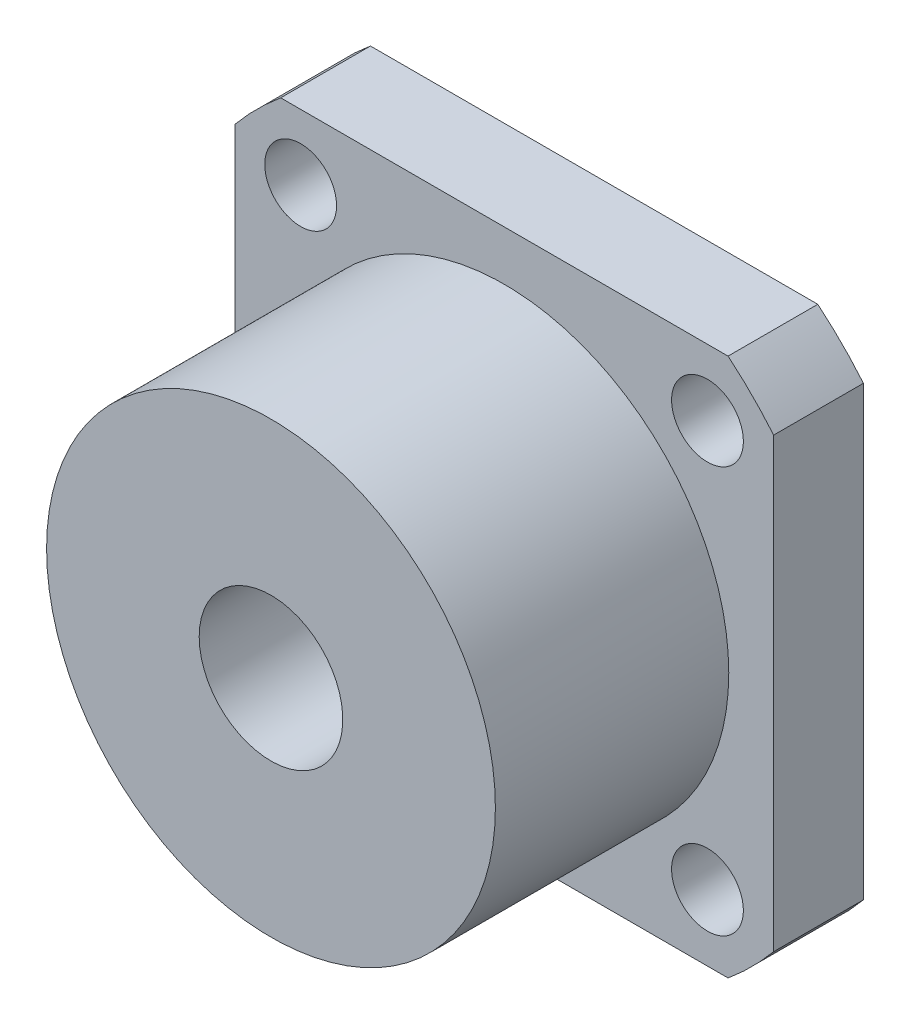
ISO-10303-21;
HEADER;
FILE_DESCRIPTION(('STEP AP214'),'2;1');
FILE_NAME('part.step','',(''),(''),'','','');
FILE_SCHEMA(('AUTOMOTIVE_DESIGN { 1 0 10303 214 1 1 1 1 }'));
ENDSEC;
DATA;
#1=APPLICATION_CONTEXT('core data for automotive mechanical design processes');
#2=APPLICATION_PROTOCOL_DEFINITION('international standard','automotive_design',2000,#1);
#3=PRODUCT_CONTEXT('',#1,'mechanical');
#4=PRODUCT('Part','Part','',(#3));
#5=PRODUCT_RELATED_PRODUCT_CATEGORY('part','',(#4));
#6=PRODUCT_DEFINITION_FORMATION('','',#4);
#7=PRODUCT_DEFINITION_CONTEXT('part definition',#1,'design');
#8=PRODUCT_DEFINITION('design','',#6,#7);
#9=PRODUCT_DEFINITION_SHAPE('','',#8);
#10=(LENGTH_UNIT() NAMED_UNIT(*) SI_UNIT(.MILLI.,.METRE.));
#11=(NAMED_UNIT(*) PLANE_ANGLE_UNIT() SI_UNIT($,.RADIAN.));
#12=(NAMED_UNIT(*) SI_UNIT($,.STERADIAN.) SOLID_ANGLE_UNIT());
#13=UNCERTAINTY_MEASURE_WITH_UNIT(LENGTH_MEASURE(1.E-05),#10,'distance_accuracy_value','');
#14=(GEOMETRIC_REPRESENTATION_CONTEXT(3) GLOBAL_UNCERTAINTY_ASSIGNED_CONTEXT((#13)) GLOBAL_UNIT_ASSIGNED_CONTEXT((#10,
#11,#12)) REPRESENTATION_CONTEXT('',''));
#15=CARTESIAN_POINT('',(0.,0.,0.));
#16=DIRECTION('',(0.,0.,1.));
#17=DIRECTION('',(1.,0.,0.));
#18=AXIS2_PLACEMENT_3D('',#15,#16,#17);
#19=CARTESIAN_POINT('',(0.,0.263671874999986,5.));
#20=DIRECTION('',(0.,0.,-1.));
#21=DIRECTION('',(-1.,0.,0.));
#22=AXIS2_PLACEMENT_3D('',#19,#20,#21);
#23=PLANE('',#22);
#24=CARTESIAN_POINT('',(0.,0.,5.));
#25=DIRECTION('',(0.,0.,-1.));
#26=DIRECTION('',(-1.,0.,0.));
#27=AXIS2_PLACEMENT_3D('',#24,#25,#26);
#28=CIRCLE('',#27,12.5);
#29=CARTESIAN_POINT('',(-12.5,0.,5.));
#30=VERTEX_POINT('',#29);
#31=EDGE_CURVE('E11',#30,#30,#28,.F.);
#32=ORIENTED_EDGE('',*,*,#31,.F.);
#33=EDGE_LOOP('',(#32));
#34=FACE_BOUND('',#33,.T.);
#35=CARTESIAN_POINT('',(0.,0.263671874999986,5.));
#36=DIRECTION('',(0.,0.,1.));
#37=DIRECTION('',(-1.,0.,0.));
#38=AXIS2_PLACEMENT_3D('',#35,#36,#37);
#39=CIRCLE('',#38,19.5);
#40=CARTESIAN_POINT('',(-12.4599357943771,15.263671875,5.));
#41=VERTEX_POINT('',#40);
#42=CARTESIAN_POINT('',(-15.,12.7236076693771,5.));
#43=VERTEX_POINT('',#42);
#44=EDGE_CURVE('E149',#41,#43,#39,.T.);
#45=ORIENTED_EDGE('',*,*,#44,.T.);
#46=DIRECTION('',(0.,-1.,0.));
#47=VECTOR('',#46,1.);
#48=CARTESIAN_POINT('',(-15.,-12.1962639193771,5.));
#49=LINE('',#48,#47);
#50=CARTESIAN_POINT('',(-15.,-12.1962639193771,5.));
#51=VERTEX_POINT('',#50);
#52=EDGE_CURVE('E97',#43,#51,#49,.T.);
#53=ORIENTED_EDGE('',*,*,#52,.T.);
#54=CARTESIAN_POINT('',(0.,0.263671874999986,5.));
#55=DIRECTION('',(0.,0.,1.));
#56=DIRECTION('',(-1.,0.,0.));
#57=AXIS2_PLACEMENT_3D('',#54,#55,#56);
#58=CIRCLE('',#57,19.5);
#59=CARTESIAN_POINT('',(-12.4599357943771,-14.736328125,5.));
#60=VERTEX_POINT('',#59);
#61=EDGE_CURVE('E181',#51,#60,#58,.T.);
#62=ORIENTED_EDGE('',*,*,#61,.T.);
#63=DIRECTION('',(1.,0.,0.));
#64=VECTOR('',#63,1.);
#65=CARTESIAN_POINT('',(-12.4599357943771,-14.736328125,5.));
#66=LINE('',#65,#64);
#67=CARTESIAN_POINT('',(12.4599357943771,-14.736328125,5.));
#68=VERTEX_POINT('',#67);
#69=EDGE_CURVE('E180',#60,#68,#66,.T.);
#70=ORIENTED_EDGE('',*,*,#69,.T.);
#71=CARTESIAN_POINT('',(0.,0.263671874999986,5.));
#72=DIRECTION('',(0.,0.,1.));
#73=DIRECTION('',(-1.,0.,0.));
#74=AXIS2_PLACEMENT_3D('',#71,#72,#73);
#75=CIRCLE('',#74,19.5);
#76=CARTESIAN_POINT('',(15.,-12.1962639193771,5.));
#77=VERTEX_POINT('',#76);
#78=EDGE_CURVE('E116',#68,#77,#75,.T.);
#79=ORIENTED_EDGE('',*,*,#78,.T.);
#80=DIRECTION('',(0.,1.,0.));
#81=VECTOR('',#80,1.);
#82=CARTESIAN_POINT('',(15.,-12.1962639193771,5.));
#83=LINE('',#82,#81);
#84=CARTESIAN_POINT('',(15.,12.7236076693771,5.));
#85=VERTEX_POINT('',#84);
#86=EDGE_CURVE('E110',#77,#85,#83,.T.);
#87=ORIENTED_EDGE('',*,*,#86,.T.);
#88=CARTESIAN_POINT('',(0.,0.263671874999986,5.));
#89=DIRECTION('',(0.,0.,1.));
#90=DIRECTION('',(-1.,0.,0.));
#91=AXIS2_PLACEMENT_3D('',#88,#89,#90);
#92=CIRCLE('',#91,19.5);
#93=CARTESIAN_POINT('',(12.4599357943771,15.263671875,5.));
#94=VERTEX_POINT('',#93);
#95=EDGE_CURVE('E114',#85,#94,#92,.T.);
#96=ORIENTED_EDGE('',*,*,#95,.T.);
#97=DIRECTION('',(-1.,0.,0.));
#98=VECTOR('',#97,1.);
#99=CARTESIAN_POINT('',(-12.4599357943771,15.263671875,5.));
#100=LINE('',#99,#98);
#101=EDGE_CURVE('E53',#94,#41,#100,.T.);
#102=ORIENTED_EDGE('',*,*,#101,.T.);
#103=EDGE_LOOP('',(#45,#53,#62,#70,#79,#87,#96,#102));
#104=FACE_BOUND('',#103,.T.);
#105=CARTESIAN_POINT('',(-11.3476470705717,11.6113189455717,5.));
#106=DIRECTION('',(0.,0.,1.));
#107=DIRECTION('',(1.,0.,0.));
#108=AXIS2_PLACEMENT_3D('',#105,#106,#107);
#109=CIRCLE('',#108,2.);
#110=CARTESIAN_POINT('',(-9.34764707057175,11.6113189455717,5.));
#111=VERTEX_POINT('',#110);
#112=EDGE_CURVE('E138',#111,#111,#109,.T.);
#113=ORIENTED_EDGE('',*,*,#112,.F.);
#114=EDGE_LOOP('',(#113));
#115=FACE_BOUND('',#114,.T.);
#116=CARTESIAN_POINT('',(11.3137084989848,11.5773803739847,5.));
#117=DIRECTION('',(0.,0.,1.));
#118=DIRECTION('',(1.,0.,0.));
#119=AXIS2_PLACEMENT_3D('',#116,#117,#118);
#120=CIRCLE('',#119,2.);
#121=CARTESIAN_POINT('',(13.3137084989848,11.5773803739847,5.));
#122=VERTEX_POINT('',#121);
#123=EDGE_CURVE('E190',#122,#122,#120,.T.);
#124=ORIENTED_EDGE('',*,*,#123,.F.);
#125=EDGE_LOOP('',(#124));
#126=FACE_BOUND('',#125,.T.);
#127=CARTESIAN_POINT('',(11.3137084989848,-11.0500366239848,5.));
#128=DIRECTION('',(0.,0.,1.));
#129=DIRECTION('',(1.,0.,0.));
#130=AXIS2_PLACEMENT_3D('',#127,#128,#129);
#131=CIRCLE('',#130,2.);
#132=CARTESIAN_POINT('',(13.3137084989848,-11.0500366239848,5.));
#133=VERTEX_POINT('',#132);
#134=EDGE_CURVE('E196',#133,#133,#131,.T.);
#135=ORIENTED_EDGE('',*,*,#134,.F.);
#136=EDGE_LOOP('',(#135));
#137=FACE_BOUND('',#136,.T.);
#138=CARTESIAN_POINT('',(-11.3137084989848,-11.0500366239848,5.));
#139=DIRECTION('',(0.,0.,1.));
#140=DIRECTION('',(1.,0.,0.));
#141=AXIS2_PLACEMENT_3D('',#138,#139,#140);
#142=CIRCLE('',#141,2.);
#143=CARTESIAN_POINT('',(-9.31370849898476,-11.0500366239848,5.));
#144=VERTEX_POINT('',#143);
#145=EDGE_CURVE('E202',#144,#144,#142,.T.);
#146=ORIENTED_EDGE('',*,*,#145,.F.);
#147=EDGE_LOOP('',(#146));
#148=FACE_BOUND('',#147,.T.);
#149=ADVANCED_FACE('F36',(#34,#104,#115,#126,#137,#148),#23,.F.);
#150=CARTESIAN_POINT('',(0.,0.263671874999986,0.));
#151=DIRECTION('',(0.,0.,-1.));
#152=DIRECTION('',(-1.,0.,0.));
#153=AXIS2_PLACEMENT_3D('',#150,#151,#152);
#154=PLANE('',#153);
#155=CARTESIAN_POINT('',(0.,0.,0.));
#156=DIRECTION('',(0.,0.,1.));
#157=DIRECTION('',(1.,0.,0.));
#158=AXIS2_PLACEMENT_3D('',#155,#156,#157);
#159=CIRCLE('',#158,4.);
#160=CARTESIAN_POINT('',(-4.,0.,0.));
#161=VERTEX_POINT('',#160);
#162=EDGE_CURVE('E216',#161,#161,#159,.T.);
#163=ORIENTED_EDGE('',*,*,#162,.T.);
#164=EDGE_LOOP('',(#163));
#165=FACE_BOUND('',#164,.T.);
#166=CARTESIAN_POINT('',(11.3137084989848,-11.0500366239848,0.));
#167=DIRECTION('',(0.,0.,1.));
#168=DIRECTION('',(1.,0.,0.));
#169=AXIS2_PLACEMENT_3D('',#166,#167,#168);
#170=CIRCLE('',#169,2.);
#171=CARTESIAN_POINT('',(13.3137084989848,-11.0500366239848,0.));
#172=VERTEX_POINT('',#171);
#173=EDGE_CURVE('E199',#172,#172,#170,.T.);
#174=ORIENTED_EDGE('',*,*,#173,.T.);
#175=EDGE_LOOP('',(#174));
#176=FACE_BOUND('',#175,.T.);
#177=CARTESIAN_POINT('',(-11.3476470705717,11.6113189455717,0.));
#178=DIRECTION('',(0.,0.,1.));
#179=DIRECTION('',(1.,0.,0.));
#180=AXIS2_PLACEMENT_3D('',#177,#178,#179);
#181=CIRCLE('',#180,2.);
#182=CARTESIAN_POINT('',(-9.34764707057175,11.6113189455717,0.));
#183=VERTEX_POINT('',#182);
#184=EDGE_CURVE('E187',#183,#183,#181,.T.);
#185=ORIENTED_EDGE('',*,*,#184,.T.);
#186=EDGE_LOOP('',(#185));
#187=FACE_BOUND('',#186,.T.);
#188=CARTESIAN_POINT('',(0.,0.263671874999986,0.));
#189=DIRECTION('',(0.,0.,1.));
#190=DIRECTION('',(-1.,0.,0.));
#191=AXIS2_PLACEMENT_3D('',#188,#189,#190);
#192=CIRCLE('',#191,19.5);
#193=CARTESIAN_POINT('',(-12.4599357943771,15.263671875,0.));
#194=VERTEX_POINT('',#193);
#195=CARTESIAN_POINT('',(-15.,12.7236076693771,0.));
#196=VERTEX_POINT('',#195);
#197=EDGE_CURVE('E134',#194,#196,#192,.T.);
#198=ORIENTED_EDGE('',*,*,#197,.F.);
#199=DIRECTION('',(-1.,0.,0.));
#200=VECTOR('',#199,1.);
#201=CARTESIAN_POINT('',(-12.4599357943771,15.263671875,0.));
#202=LINE('',#201,#200);
#203=CARTESIAN_POINT('',(12.4599357943771,15.263671875,0.));
#204=VERTEX_POINT('',#203);
#205=EDGE_CURVE('E88',#204,#194,#202,.T.);
#206=ORIENTED_EDGE('',*,*,#205,.F.);
#207=CARTESIAN_POINT('',(0.,0.263671874999986,0.));
#208=DIRECTION('',(0.,0.,1.));
#209=DIRECTION('',(-1.,0.,0.));
#210=AXIS2_PLACEMENT_3D('',#207,#208,#209);
#211=CIRCLE('',#210,19.5);
#212=CARTESIAN_POINT('',(15.,12.7236076693771,0.));
#213=VERTEX_POINT('',#212);
#214=EDGE_CURVE('E82',#213,#204,#211,.T.);
#215=ORIENTED_EDGE('',*,*,#214,.F.);
#216=DIRECTION('',(0.,1.,0.));
#217=VECTOR('',#216,1.);
#218=CARTESIAN_POINT('',(15.,-12.1962639193771,0.));
#219=LINE('',#218,#217);
#220=CARTESIAN_POINT('',(15.,-12.1962639193771,0.));
#221=VERTEX_POINT('',#220);
#222=EDGE_CURVE('E124',#221,#213,#219,.T.);
#223=ORIENTED_EDGE('',*,*,#222,.F.);
#224=CARTESIAN_POINT('',(0.,0.263671874999986,0.));
#225=DIRECTION('',(0.,0.,1.));
#226=DIRECTION('',(-1.,0.,0.));
#227=AXIS2_PLACEMENT_3D('',#224,#225,#226);
#228=CIRCLE('',#227,19.5);
#229=CARTESIAN_POINT('',(12.4599357943771,-14.736328125,0.));
#230=VERTEX_POINT('',#229);
#231=EDGE_CURVE('E144',#230,#221,#228,.T.);
#232=ORIENTED_EDGE('',*,*,#231,.F.);
#233=DIRECTION('',(1.,0.,0.));
#234=VECTOR('',#233,1.);
#235=CARTESIAN_POINT('',(-12.4599357943771,-14.736328125,0.));
#236=LINE('',#235,#234);
#237=CARTESIAN_POINT('',(-12.4599357943771,-14.736328125,0.));
#238=VERTEX_POINT('',#237);
#239=EDGE_CURVE('E142',#238,#230,#236,.T.);
#240=ORIENTED_EDGE('',*,*,#239,.F.);
#241=CARTESIAN_POINT('',(0.,0.263671874999986,0.));
#242=DIRECTION('',(0.,0.,1.));
#243=DIRECTION('',(-1.,0.,0.));
#244=AXIS2_PLACEMENT_3D('',#241,#242,#243);
#245=CIRCLE('',#244,19.5);
#246=CARTESIAN_POINT('',(-15.,-12.1962639193771,0.));
#247=VERTEX_POINT('',#246);
#248=EDGE_CURVE('E140',#247,#238,#245,.T.);
#249=ORIENTED_EDGE('',*,*,#248,.F.);
#250=DIRECTION('',(0.,-1.,0.));
#251=VECTOR('',#250,1.);
#252=CARTESIAN_POINT('',(-15.,-12.1962639193771,0.));
#253=LINE('',#252,#251);
#254=EDGE_CURVE('E137',#196,#247,#253,.T.);
#255=ORIENTED_EDGE('',*,*,#254,.F.);
#256=EDGE_LOOP('',(#198,#206,#215,#223,#232,#240,#249,#255));
#257=FACE_BOUND('',#256,.T.);
#258=CARTESIAN_POINT('',(11.3137084989848,11.5773803739847,0.));
#259=DIRECTION('',(0.,0.,1.));
#260=DIRECTION('',(1.,0.,0.));
#261=AXIS2_PLACEMENT_3D('',#258,#259,#260);
#262=CIRCLE('',#261,2.);
#263=CARTESIAN_POINT('',(13.3137084989848,11.5773803739847,0.));
#264=VERTEX_POINT('',#263);
#265=EDGE_CURVE('E193',#264,#264,#262,.T.);
#266=ORIENTED_EDGE('',*,*,#265,.T.);
#267=EDGE_LOOP('',(#266));
#268=FACE_BOUND('',#267,.T.);
#269=CARTESIAN_POINT('',(-11.3137084989848,-11.0500366239848,0.));
#270=DIRECTION('',(0.,0.,1.));
#271=DIRECTION('',(1.,0.,0.));
#272=AXIS2_PLACEMENT_3D('',#269,#270,#271);
#273=CIRCLE('',#272,2.);
#274=CARTESIAN_POINT('',(-9.31370849898476,-11.0500366239848,0.));
#275=VERTEX_POINT('',#274);
#276=EDGE_CURVE('E205',#275,#275,#273,.T.);
#277=ORIENTED_EDGE('',*,*,#276,.T.);
#278=EDGE_LOOP('',(#277));
#279=FACE_BOUND('',#278,.T.);
#280=ADVANCED_FACE('F167',(#165,#176,#187,#257,#268,#279),#154,.T.);
#281=CARTESIAN_POINT('',(0.,0.263671874999986,5.));
#282=DIRECTION('',(0.,0.,-1.));
#283=DIRECTION('',(-1.,0.,0.));
#284=AXIS2_PLACEMENT_3D('',#281,#282,#283);
#285=CYLINDRICAL_SURFACE('',#284,19.5);
#286=ORIENTED_EDGE('',*,*,#197,.T.);
#287=DIRECTION('',(0.,0.,-1.));
#288=VECTOR('',#287,1.);
#289=CARTESIAN_POINT('',(-15.,12.7236076693771,5.));
#290=LINE('',#289,#288);
#291=EDGE_CURVE('E45',#43,#196,#290,.T.);
#292=ORIENTED_EDGE('',*,*,#291,.F.);
#293=ORIENTED_EDGE('',*,*,#44,.F.);
#294=DIRECTION('',(0.,0.,-1.));
#295=VECTOR('',#294,1.);
#296=CARTESIAN_POINT('',(-12.4599357943771,15.263671875,5.));
#297=LINE('',#296,#295);
#298=EDGE_CURVE('E130',#41,#194,#297,.T.);
#299=ORIENTED_EDGE('',*,*,#298,.T.);
#300=EDGE_LOOP('',(#286,#292,#293,#299));
#301=FACE_BOUND('',#300,.T.);
#302=ADVANCED_FACE('F38',(#301),#285,.T.);
#303=CARTESIAN_POINT('',(-15.,-12.1962639193771,5.));
#304=DIRECTION('',(1.,0.,0.));
#305=DIRECTION('',(0.,0.,-1.));
#306=AXIS2_PLACEMENT_3D('',#303,#304,#305);
#307=PLANE('',#306);
#308=ORIENTED_EDGE('',*,*,#254,.T.);
#309=DIRECTION('',(0.,0.,-1.));
#310=VECTOR('',#309,1.);
#311=CARTESIAN_POINT('',(-15.,-12.1962639193771,5.));
#312=LINE('',#311,#310);
#313=EDGE_CURVE('E159',#51,#247,#312,.T.);
#314=ORIENTED_EDGE('',*,*,#313,.F.);
#315=ORIENTED_EDGE('',*,*,#52,.F.);
#316=ORIENTED_EDGE('',*,*,#291,.T.);
#317=EDGE_LOOP('',(#308,#314,#315,#316));
#318=FACE_BOUND('',#317,.T.);
#319=ADVANCED_FACE('F162',(#318),#307,.F.);
#320=CARTESIAN_POINT('',(0.,0.263671874999986,5.));
#321=DIRECTION('',(0.,0.,-1.));
#322=DIRECTION('',(-1.,0.,0.));
#323=AXIS2_PLACEMENT_3D('',#320,#321,#322);
#324=CYLINDRICAL_SURFACE('',#323,19.5);
#325=ORIENTED_EDGE('',*,*,#248,.T.);
#326=DIRECTION('',(0.,0.,-1.));
#327=VECTOR('',#326,1.);
#328=CARTESIAN_POINT('',(-12.4599357943771,-14.736328125,5.));
#329=LINE('',#328,#327);
#330=EDGE_CURVE('E156',#60,#238,#329,.T.);
#331=ORIENTED_EDGE('',*,*,#330,.F.);
#332=ORIENTED_EDGE('',*,*,#61,.F.);
#333=ORIENTED_EDGE('',*,*,#313,.T.);
#334=EDGE_LOOP('',(#325,#331,#332,#333));
#335=FACE_BOUND('',#334,.T.);
#336=ADVANCED_FACE('F174',(#335),#324,.T.);
#337=CARTESIAN_POINT('',(-12.4599357943771,-14.736328125,5.));
#338=DIRECTION('',(0.,1.,0.));
#339=DIRECTION('',(0.,0.,1.));
#340=AXIS2_PLACEMENT_3D('',#337,#338,#339);
#341=PLANE('',#340);
#342=ORIENTED_EDGE('',*,*,#239,.T.);
#343=DIRECTION('',(0.,0.,-1.));
#344=VECTOR('',#343,1.);
#345=CARTESIAN_POINT('',(12.4599357943771,-14.736328125,5.));
#346=LINE('',#345,#344);
#347=EDGE_CURVE('E153',#68,#230,#346,.T.);
#348=ORIENTED_EDGE('',*,*,#347,.F.);
#349=ORIENTED_EDGE('',*,*,#69,.F.);
#350=ORIENTED_EDGE('',*,*,#330,.T.);
#351=EDGE_LOOP('',(#342,#348,#349,#350));
#352=FACE_BOUND('',#351,.T.);
#353=ADVANCED_FACE('F178',(#352),#341,.F.);
#354=CARTESIAN_POINT('',(0.,0.263671874999986,5.));
#355=DIRECTION('',(0.,0.,-1.));
#356=DIRECTION('',(-1.,0.,0.));
#357=AXIS2_PLACEMENT_3D('',#354,#355,#356);
#358=CYLINDRICAL_SURFACE('',#357,19.5);
#359=ORIENTED_EDGE('',*,*,#231,.T.);
#360=DIRECTION('',(0.,0.,-1.));
#361=VECTOR('',#360,1.);
#362=CARTESIAN_POINT('',(15.,-12.1962639193771,5.));
#363=LINE('',#362,#361);
#364=EDGE_CURVE('E125',#77,#221,#363,.T.);
#365=ORIENTED_EDGE('',*,*,#364,.F.);
#366=ORIENTED_EDGE('',*,*,#78,.F.);
#367=ORIENTED_EDGE('',*,*,#347,.T.);
#368=EDGE_LOOP('',(#359,#365,#366,#367));
#369=FACE_BOUND('',#368,.T.);
#370=ADVANCED_FACE('F253',(#369),#358,.T.);
#371=CARTESIAN_POINT('',(15.,-12.1962639193771,5.));
#372=DIRECTION('',(-1.,0.,0.));
#373=DIRECTION('',(0.,0.,1.));
#374=AXIS2_PLACEMENT_3D('',#371,#372,#373);
#375=PLANE('',#374);
#376=ORIENTED_EDGE('',*,*,#222,.T.);
#377=DIRECTION('',(0.,0.,-1.));
#378=VECTOR('',#377,1.);
#379=CARTESIAN_POINT('',(15.,12.7236076693771,5.));
#380=LINE('',#379,#378);
#381=EDGE_CURVE('E121',#85,#213,#380,.T.);
#382=ORIENTED_EDGE('',*,*,#381,.F.);
#383=ORIENTED_EDGE('',*,*,#86,.F.);
#384=ORIENTED_EDGE('',*,*,#364,.T.);
#385=EDGE_LOOP('',(#376,#382,#383,#384));
#386=FACE_BOUND('',#385,.T.);
#387=ADVANCED_FACE('F122',(#386),#375,.F.);
#388=CARTESIAN_POINT('',(0.,0.263671874999986,5.));
#389=DIRECTION('',(0.,0.,-1.));
#390=DIRECTION('',(-1.,0.,0.));
#391=AXIS2_PLACEMENT_3D('',#388,#389,#390);
#392=CYLINDRICAL_SURFACE('',#391,19.5);
#393=ORIENTED_EDGE('',*,*,#214,.T.);
#394=DIRECTION('',(0.,0.,-1.));
#395=VECTOR('',#394,1.);
#396=CARTESIAN_POINT('',(12.4599357943771,15.263671875,5.));
#397=LINE('',#396,#395);
#398=EDGE_CURVE('E126',#94,#204,#397,.T.);
#399=ORIENTED_EDGE('',*,*,#398,.F.);
#400=ORIENTED_EDGE('',*,*,#95,.F.);
#401=ORIENTED_EDGE('',*,*,#381,.T.);
#402=EDGE_LOOP('',(#393,#399,#400,#401));
#403=FACE_BOUND('',#402,.T.);
#404=ADVANCED_FACE('F128',(#403),#392,.T.);
#405=CARTESIAN_POINT('',(-12.4599357943771,15.263671875,5.));
#406=DIRECTION('',(0.,-1.,0.));
#407=DIRECTION('',(0.,0.,-1.));
#408=AXIS2_PLACEMENT_3D('',#405,#406,#407);
#409=PLANE('',#408);
#410=ORIENTED_EDGE('',*,*,#205,.T.);
#411=ORIENTED_EDGE('',*,*,#298,.F.);
#412=ORIENTED_EDGE('',*,*,#101,.F.);
#413=ORIENTED_EDGE('',*,*,#398,.T.);
#414=EDGE_LOOP('',(#410,#411,#412,#413));
#415=FACE_BOUND('',#414,.T.);
#416=ADVANCED_FACE('F246',(#415),#409,.F.);
#417=CARTESIAN_POINT('',(-11.3476470705717,11.6113189455717,5.));
#418=DIRECTION('',(0.,0.,-1.));
#419=DIRECTION('',(-1.,0.,0.));
#420=AXIS2_PLACEMENT_3D('',#417,#418,#419);
#421=CYLINDRICAL_SURFACE('',#420,2.);
#422=ORIENTED_EDGE('',*,*,#112,.T.);
#423=EDGE_LOOP('',(#422));
#424=FACE_BOUND('',#423,.T.);
#425=ORIENTED_EDGE('',*,*,#184,.F.);
#426=EDGE_LOOP('',(#425));
#427=FACE_BOUND('',#426,.T.);
#428=ADVANCED_FACE('F243',(#424,#427),#421,.F.);
#429=CARTESIAN_POINT('',(11.3137084989848,11.5773803739847,5.));
#430=DIRECTION('',(0.,0.,-1.));
#431=DIRECTION('',(-1.,0.,0.));
#432=AXIS2_PLACEMENT_3D('',#429,#430,#431);
#433=CYLINDRICAL_SURFACE('',#432,2.);
#434=ORIENTED_EDGE('',*,*,#123,.T.);
#435=EDGE_LOOP('',(#434));
#436=FACE_BOUND('',#435,.T.);
#437=ORIENTED_EDGE('',*,*,#265,.F.);
#438=EDGE_LOOP('',(#437));
#439=FACE_BOUND('',#438,.T.);
#440=ADVANCED_FACE('F310',(#436,#439),#433,.F.);
#441=CARTESIAN_POINT('',(11.3137084989848,-11.0500366239848,5.));
#442=DIRECTION('',(0.,0.,-1.));
#443=DIRECTION('',(-1.,0.,0.));
#444=AXIS2_PLACEMENT_3D('',#441,#442,#443);
#445=CYLINDRICAL_SURFACE('',#444,2.);
#446=ORIENTED_EDGE('',*,*,#134,.T.);
#447=EDGE_LOOP('',(#446));
#448=FACE_BOUND('',#447,.T.);
#449=ORIENTED_EDGE('',*,*,#173,.F.);
#450=EDGE_LOOP('',(#449));
#451=FACE_BOUND('',#450,.T.);
#452=ADVANCED_FACE('F301',(#448,#451),#445,.F.);
#453=CARTESIAN_POINT('',(-11.3137084989848,-11.0500366239848,5.));
#454=DIRECTION('',(0.,0.,-1.));
#455=DIRECTION('',(-1.,0.,0.));
#456=AXIS2_PLACEMENT_3D('',#453,#454,#455);
#457=CYLINDRICAL_SURFACE('',#456,2.);
#458=ORIENTED_EDGE('',*,*,#145,.T.);
#459=EDGE_LOOP('',(#458));
#460=FACE_BOUND('',#459,.T.);
#461=ORIENTED_EDGE('',*,*,#276,.F.);
#462=EDGE_LOOP('',(#461));
#463=FACE_BOUND('',#462,.T.);
#464=ADVANCED_FACE('F293',(#460,#463),#457,.F.);
#465=CARTESIAN_POINT('',(0.,0.,18.));
#466=DIRECTION('',(0.,0.,1.));
#467=DIRECTION('',(1.,0.,0.));
#468=AXIS2_PLACEMENT_3D('',#465,#466,#467);
#469=PLANE('',#468);
#470=CARTESIAN_POINT('',(0.,0.,18.));
#471=DIRECTION('',(0.,0.,1.));
#472=DIRECTION('',(1.,0.,0.));
#473=AXIS2_PLACEMENT_3D('',#470,#471,#472);
#474=CIRCLE('',#473,12.5);
#475=CARTESIAN_POINT('',(-12.5,0.,18.));
#476=VERTEX_POINT('',#475);
#477=EDGE_CURVE('E208',#476,#476,#474,.T.);
#478=ORIENTED_EDGE('',*,*,#477,.T.);
#479=EDGE_LOOP('',(#478));
#480=FACE_BOUND('',#479,.T.);
#481=CARTESIAN_POINT('',(0.,0.,18.));
#482=DIRECTION('',(0.,0.,1.));
#483=DIRECTION('',(1.,0.,0.));
#484=AXIS2_PLACEMENT_3D('',#481,#482,#483);
#485=CIRCLE('',#484,4.);
#486=CARTESIAN_POINT('',(-4.,0.,18.));
#487=VERTEX_POINT('',#486);
#488=EDGE_CURVE('E213',#487,#487,#485,.T.);
#489=ORIENTED_EDGE('',*,*,#488,.F.);
#490=EDGE_LOOP('',(#489));
#491=FACE_BOUND('',#490,.T.);
#492=ADVANCED_FACE('F230',(#480,#491),#469,.T.);
#493=CARTESIAN_POINT('',(0.,0.,18.));
#494=DIRECTION('',(0.,0.,-1.));
#495=DIRECTION('',(-1.,0.,0.));
#496=AXIS2_PLACEMENT_3D('',#493,#494,#495);
#497=CYLINDRICAL_SURFACE('',#496,12.5);
#498=CARTESIAN_POINT('',(-12.5,0.,18.));
#499=CARTESIAN_POINT('',(-12.5,0.,17.8645833333333));
#500=CARTESIAN_POINT('',(-12.5,0.,17.7291666666667));
#501=CARTESIAN_POINT('',(-12.5,0.,17.4583333333333));
#502=CARTESIAN_POINT('',(-12.5,0.,17.3229166666667));
#503=CARTESIAN_POINT('',(-12.5,0.,17.0520833333333));
#504=CARTESIAN_POINT('',(-12.5,0.,16.9166666666667));
#505=CARTESIAN_POINT('',(-12.5,0.,16.6458333333333));
#506=CARTESIAN_POINT('',(-12.5,0.,16.5104166666667));
#507=CARTESIAN_POINT('',(-12.5,0.,16.2395833333333));
#508=CARTESIAN_POINT('',(-12.5,0.,16.1041666666667));
#509=CARTESIAN_POINT('',(-12.5,0.,15.8333333333333));
#510=CARTESIAN_POINT('',(-12.5,0.,15.6979166666667));
#511=CARTESIAN_POINT('',(-12.5,0.,15.4270833333333));
#512=CARTESIAN_POINT('',(-12.5,0.,15.2916666666667));
#513=CARTESIAN_POINT('',(-12.5,0.,15.0208333333333));
#514=CARTESIAN_POINT('',(-12.5,0.,14.8854166666667));
#515=CARTESIAN_POINT('',(-12.5,0.,14.6145833333333));
#516=CARTESIAN_POINT('',(-12.5,0.,14.4791666666667));
#517=CARTESIAN_POINT('',(-12.5,0.,14.2083333333333));
#518=CARTESIAN_POINT('',(-12.5,0.,14.0729166666667));
#519=CARTESIAN_POINT('',(-12.5,0.,13.8020833333333));
#520=CARTESIAN_POINT('',(-12.5,0.,13.6666666666667));
#521=CARTESIAN_POINT('',(-12.5,0.,13.3958333333333));
#522=CARTESIAN_POINT('',(-12.5,0.,13.2604166666667));
#523=CARTESIAN_POINT('',(-12.5,0.,12.9895833333333));
#524=CARTESIAN_POINT('',(-12.5,0.,12.8541666666667));
#525=CARTESIAN_POINT('',(-12.5,0.,12.5833333333333));
#526=CARTESIAN_POINT('',(-12.5,0.,12.4479166666667));
#527=CARTESIAN_POINT('',(-12.5,0.,12.1770833333333));
#528=CARTESIAN_POINT('',(-12.5,0.,12.0416666666667));
#529=CARTESIAN_POINT('',(-12.5,0.,11.7708333333333));
#530=CARTESIAN_POINT('',(-12.5,0.,11.6354166666667));
#531=CARTESIAN_POINT('',(-12.5,0.,11.3645833333333));
#532=CARTESIAN_POINT('',(-12.5,0.,11.2291666666667));
#533=CARTESIAN_POINT('',(-12.5,0.,10.9583333333333));
#534=CARTESIAN_POINT('',(-12.5,0.,10.8229166666667));
#535=CARTESIAN_POINT('',(-12.5,0.,10.5520833333333));
#536=CARTESIAN_POINT('',(-12.5,0.,10.4166666666667));
#537=CARTESIAN_POINT('',(-12.5,0.,10.1458333333333));
#538=CARTESIAN_POINT('',(-12.5,0.,10.0104166666667));
#539=CARTESIAN_POINT('',(-12.5,0.,9.73958333333333));
#540=CARTESIAN_POINT('',(-12.5,0.,9.60416666666667));
#541=CARTESIAN_POINT('',(-12.5,0.,9.33333333333333));
#542=CARTESIAN_POINT('',(-12.5,0.,9.19791666666667));
#543=CARTESIAN_POINT('',(-12.5,0.,8.92708333333333));
#544=CARTESIAN_POINT('',(-12.5,0.,8.79166666666667));
#545=CARTESIAN_POINT('',(-12.5,0.,8.52083333333334));
#546=CARTESIAN_POINT('',(-12.5,0.,8.38541666666667));
#547=CARTESIAN_POINT('',(-12.5,0.,8.11458333333333));
#548=CARTESIAN_POINT('',(-12.5,0.,7.97916666666667));
#549=CARTESIAN_POINT('',(-12.5,0.,7.70833333333334));
#550=CARTESIAN_POINT('',(-12.5,0.,7.57291666666667));
#551=CARTESIAN_POINT('',(-12.5,0.,7.30208333333333));
#552=CARTESIAN_POINT('',(-12.5,0.,7.16666666666667));
#553=CARTESIAN_POINT('',(-12.5,0.,6.89583333333334));
#554=CARTESIAN_POINT('',(-12.5,0.,6.76041666666667));
#555=CARTESIAN_POINT('',(-12.5,0.,6.48958333333334));
#556=CARTESIAN_POINT('',(-12.5,0.,6.35416666666667));
#557=CARTESIAN_POINT('',(-12.5,0.,6.08333333333334));
#558=CARTESIAN_POINT('',(-12.5,0.,5.94791666666667));
#559=CARTESIAN_POINT('',(-12.5,0.,5.67708333333333));
#560=CARTESIAN_POINT('',(-12.5,0.,5.54166666666667));
#561=CARTESIAN_POINT('',(-12.5,0.,5.27083333333334));
#562=CARTESIAN_POINT('',(-12.5,0.,5.13541666666667));
#563=CARTESIAN_POINT('',(-12.5,0.,5.));
#564=B_SPLINE_CURVE_WITH_KNOTS('',3,(#498,#499,#500,#501,#502,#503,#504,#505,#506,#507,#508,
#509,#510,#511,#512,#513,#514,#515,#516,#517,#518,#519,#520,#521,#522,#523,#524,#525,#526,#527,
#528,#529,#530,#531,#532,#533,#534,#535,#536,#537,#538,#539,#540,#541,#542,#543,#544,#545,#546,
#547,#548,#549,#550,#551,#552,#553,#554,#555,#556,#557,#558,#559,#560,#561,#562,#563),
.UNSPECIFIED.,.F.,.F.,(4,2,2,2,2,2,2,2,2,2,2,2,2,2,2,2,2,2,2,2,2,2,2,2,2,2,2,2,2,2,2,2,4),(0.,
0.40625,0.812500000000001,1.21875,1.625,2.03125,2.4375,2.84375,3.25,3.65625,4.0625,4.46875,
4.875,5.28125,5.6875,6.09375,6.5,6.90625,7.3125,7.71875,8.125,8.53125,8.9375,9.34375,9.75,
10.15625,10.5625,10.96875,11.375,11.78125,12.1875,12.59375,13.),.UNSPECIFIED.);
#565=EDGE_CURVE('BSEAM224',#476,#30,#564,.T.);
#566=ORIENTED_EDGE('',*,*,#477,.F.);
#567=ORIENTED_EDGE('',*,*,#31,.T.);
#568=ORIENTED_EDGE('',*,*,#565,.T.);
#569=ORIENTED_EDGE('',*,*,#565,.F.);
#570=EDGE_LOOP('',(#566,#568,#567,#569));
#571=FACE_BOUND('',#570,.T.);
#572=ADVANCED_FACE('F224',(#571),#497,.T.);
#573=CARTESIAN_POINT('',(0.,0.,18.));
#574=DIRECTION('',(0.,0.,-1.));
#575=DIRECTION('',(-1.,0.,0.));
#576=AXIS2_PLACEMENT_3D('',#573,#574,#575);
#577=CYLINDRICAL_SURFACE('',#576,4.);
#578=CARTESIAN_POINT('',(-4.,0.,18.));
#579=CARTESIAN_POINT('',(-4.,0.,17.8125));
#580=CARTESIAN_POINT('',(-4.,0.,17.625));
#581=CARTESIAN_POINT('',(-4.,0.,17.25));
#582=CARTESIAN_POINT('',(-4.,0.,17.0625));
#583=CARTESIAN_POINT('',(-4.,0.,16.6875));
#584=CARTESIAN_POINT('',(-4.,0.,16.5));
#585=CARTESIAN_POINT('',(-4.,0.,16.125));
#586=CARTESIAN_POINT('',(-4.,0.,15.9375));
#587=CARTESIAN_POINT('',(-4.,0.,15.5625));
#588=CARTESIAN_POINT('',(-4.,0.,15.375));
#589=CARTESIAN_POINT('',(-4.,0.,15.));
#590=CARTESIAN_POINT('',(-4.,0.,14.8125));
#591=CARTESIAN_POINT('',(-4.,0.,14.4375));
#592=CARTESIAN_POINT('',(-4.,0.,14.25));
#593=CARTESIAN_POINT('',(-4.,0.,13.875));
#594=CARTESIAN_POINT('',(-4.,0.,13.6875));
#595=CARTESIAN_POINT('',(-4.,0.,13.3125));
#596=CARTESIAN_POINT('',(-4.,0.,13.125));
#597=CARTESIAN_POINT('',(-4.,0.,12.75));
#598=CARTESIAN_POINT('',(-4.,0.,12.5625));
#599=CARTESIAN_POINT('',(-4.,0.,12.1875));
#600=CARTESIAN_POINT('',(-4.,0.,12.));
#601=CARTESIAN_POINT('',(-4.,0.,11.625));
#602=CARTESIAN_POINT('',(-4.,0.,11.4375));
#603=CARTESIAN_POINT('',(-4.,0.,11.0625));
#604=CARTESIAN_POINT('',(-4.,0.,10.875));
#605=CARTESIAN_POINT('',(-4.,0.,10.5));
#606=CARTESIAN_POINT('',(-4.,0.,10.3125));
#607=CARTESIAN_POINT('',(-4.,0.,9.9375));
#608=CARTESIAN_POINT('',(-4.,0.,9.75));
#609=CARTESIAN_POINT('',(-4.,0.,9.375));
#610=CARTESIAN_POINT('',(-4.,0.,9.1875));
#611=CARTESIAN_POINT('',(-4.,0.,8.8125));
#612=CARTESIAN_POINT('',(-4.,0.,8.625));
#613=CARTESIAN_POINT('',(-4.,0.,8.25));
#614=CARTESIAN_POINT('',(-4.,0.,8.0625));
#615=CARTESIAN_POINT('',(-4.,0.,7.6875));
#616=CARTESIAN_POINT('',(-4.,0.,7.5));
#617=CARTESIAN_POINT('',(-4.,0.,7.125));
#618=CARTESIAN_POINT('',(-4.,0.,6.9375));
#619=CARTESIAN_POINT('',(-4.,0.,6.5625));
#620=CARTESIAN_POINT('',(-4.,0.,6.375));
#621=CARTESIAN_POINT('',(-4.,0.,6.));
#622=CARTESIAN_POINT('',(-4.,0.,5.8125));
#623=CARTESIAN_POINT('',(-4.,0.,5.4375));
#624=CARTESIAN_POINT('',(-4.,0.,5.25));
#625=CARTESIAN_POINT('',(-4.,0.,4.875));
#626=CARTESIAN_POINT('',(-4.,0.,4.6875));
#627=CARTESIAN_POINT('',(-4.,0.,4.3125));
#628=CARTESIAN_POINT('',(-4.,0.,4.125));
#629=CARTESIAN_POINT('',(-4.,0.,3.75));
#630=CARTESIAN_POINT('',(-4.,0.,3.5625));
#631=CARTESIAN_POINT('',(-4.,0.,3.1875));
#632=CARTESIAN_POINT('',(-4.,0.,3.));
#633=CARTESIAN_POINT('',(-4.,0.,2.625));
#634=CARTESIAN_POINT('',(-4.,0.,2.4375));
#635=CARTESIAN_POINT('',(-4.,0.,2.0625));
#636=CARTESIAN_POINT('',(-4.,0.,1.875));
#637=CARTESIAN_POINT('',(-4.,0.,1.5));
#638=CARTESIAN_POINT('',(-4.,0.,1.3125));
#639=CARTESIAN_POINT('',(-4.,0.,0.937500000000001));
#640=CARTESIAN_POINT('',(-4.,0.,0.750000000000001));
#641=CARTESIAN_POINT('',(-4.,0.,0.375));
#642=CARTESIAN_POINT('',(-4.,0.,0.1875));
#643=CARTESIAN_POINT('',(-4.,0.,0.));
#644=B_SPLINE_CURVE_WITH_KNOTS('',3,(#578,#579,#580,#581,#582,#583,#584,#585,#586,#587,#588,
#589,#590,#591,#592,#593,#594,#595,#596,#597,#598,#599,#600,#601,#602,#603,#604,#605,#606,#607,
#608,#609,#610,#611,#612,#613,#614,#615,#616,#617,#618,#619,#620,#621,#622,#623,#624,#625,#626,
#627,#628,#629,#630,#631,#632,#633,#634,#635,#636,#637,#638,#639,#640,#641,#642,#643),
.UNSPECIFIED.,.F.,.F.,(4,2,2,2,2,2,2,2,2,2,2,2,2,2,2,2,2,2,2,2,2,2,2,2,2,2,2,2,2,2,2,2,4),(0.,
0.5625,1.125,1.6875,2.25,2.8125,3.375,3.9375,4.5,5.0625,5.625,6.1875,6.75,7.3125,7.875,8.4375,
9.,9.5625,10.125,10.6875,11.25,11.8125,12.375,12.9375,13.5,14.0625,14.625,15.1875,15.75,16.3125,
16.875,17.4375,18.),.UNSPECIFIED.);
#645=EDGE_CURVE('BSEAM222',#487,#161,#644,.T.);
#646=ORIENTED_EDGE('',*,*,#488,.T.);
#647=ORIENTED_EDGE('',*,*,#162,.F.);
#648=ORIENTED_EDGE('',*,*,#645,.T.);
#649=ORIENTED_EDGE('',*,*,#645,.F.);
#650=EDGE_LOOP('',(#646,#648,#647,#649));
#651=FACE_BOUND('',#650,.T.);
#652=ADVANCED_FACE('F222',(#651),#577,.F.);
#653=CLOSED_SHELL('',(#149,#280,#302,#319,#336,#353,#370,#387,#404,#416,#428,#440,#452,#464,
#492,#572,#652));
#654=MANIFOLD_SOLID_BREP('B2',#653);
#655=ADVANCED_BREP_SHAPE_REPRESENTATION('',(#18,#654),#14);
#656=SHAPE_DEFINITION_REPRESENTATION(#9,#655);
ENDSEC;
END-ISO-10303-21;
